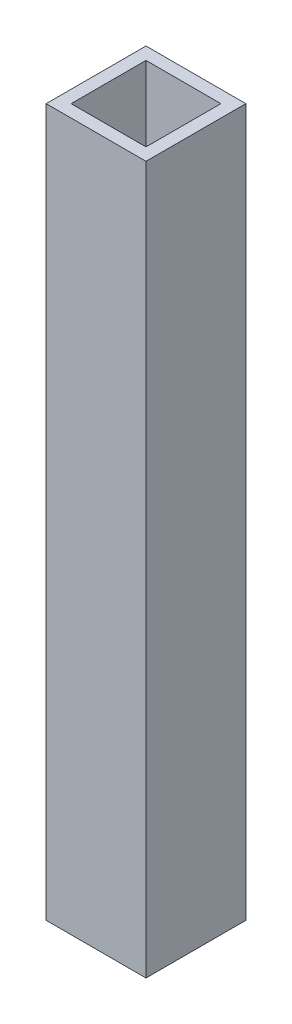
ISO-10303-21;
HEADER;
FILE_DESCRIPTION(('STEP AP214'),'2;1');
FILE_NAME('part.step','',(''),(''),'','','');
FILE_SCHEMA(('AUTOMOTIVE_DESIGN { 1 0 10303 214 1 1 1 1 }'));
ENDSEC;
DATA;
#1=APPLICATION_CONTEXT('core data for automotive mechanical design processes');
#2=APPLICATION_PROTOCOL_DEFINITION('international standard','automotive_design',2000,#1);
#3=PRODUCT_CONTEXT('',#1,'mechanical');
#4=PRODUCT('Part','Part','',(#3));
#5=PRODUCT_RELATED_PRODUCT_CATEGORY('part','',(#4));
#6=PRODUCT_DEFINITION_FORMATION('','',#4);
#7=PRODUCT_DEFINITION_CONTEXT('part definition',#1,'design');
#8=PRODUCT_DEFINITION('design','',#6,#7);
#9=PRODUCT_DEFINITION_SHAPE('','',#8);
#10=(LENGTH_UNIT() NAMED_UNIT(*) SI_UNIT(.MILLI.,.METRE.));
#11=(NAMED_UNIT(*) PLANE_ANGLE_UNIT() SI_UNIT($,.RADIAN.));
#12=(NAMED_UNIT(*) SI_UNIT($,.STERADIAN.) SOLID_ANGLE_UNIT());
#13=UNCERTAINTY_MEASURE_WITH_UNIT(LENGTH_MEASURE(1.E-05),#10,'distance_accuracy_value','');
#14=(GEOMETRIC_REPRESENTATION_CONTEXT(3) GLOBAL_UNCERTAINTY_ASSIGNED_CONTEXT((#13)) GLOBAL_UNIT_ASSIGNED_CONTEXT((#10,
#11,#12)) REPRESENTATION_CONTEXT('',''));
#15=CARTESIAN_POINT('',(0.,0.,0.));
#16=DIRECTION('',(0.,0.,1.));
#17=DIRECTION('',(1.,0.,0.));
#18=AXIS2_PLACEMENT_3D('',#15,#16,#17);
#19=CARTESIAN_POINT('',(0.,170.,0.));
#20=DIRECTION('',(0.,1.,0.));
#21=DIRECTION('',(0.,0.,1.));
#22=AXIS2_PLACEMENT_3D('',#19,#20,#21);
#23=PLANE('',#22);
#24=DIRECTION('',(0.,0.,-1.));
#25=VECTOR('',#24,1.);
#26=CARTESIAN_POINT('',(12.,170.,0.));
#27=LINE('',#26,#25);
#28=CARTESIAN_POINT('',(12.,170.,12.));
#29=VERTEX_POINT('',#28);
#30=CARTESIAN_POINT('',(12.,170.,-12.));
#31=VERTEX_POINT('',#30);
#32=EDGE_CURVE('E164',#29,#31,#27,.T.);
#33=ORIENTED_EDGE('',*,*,#32,.T.);
#34=DIRECTION('',(-1.,0.,0.));
#35=VECTOR('',#34,1.);
#36=CARTESIAN_POINT('',(0.,170.,-12.));
#37=LINE('',#36,#35);
#38=CARTESIAN_POINT('',(-12.,170.,-12.));
#39=VERTEX_POINT('',#38);
#40=EDGE_CURVE('E167',#31,#39,#37,.T.);
#41=ORIENTED_EDGE('',*,*,#40,.T.);
#42=DIRECTION('',(0.,0.,1.));
#43=VECTOR('',#42,1.);
#44=CARTESIAN_POINT('',(-12.,170.,0.));
#45=LINE('',#44,#43);
#46=CARTESIAN_POINT('',(-12.,170.,12.));
#47=VERTEX_POINT('',#46);
#48=EDGE_CURVE('E170',#39,#47,#45,.T.);
#49=ORIENTED_EDGE('',*,*,#48,.T.);
#50=DIRECTION('',(1.,0.,0.));
#51=VECTOR('',#50,1.);
#52=CARTESIAN_POINT('',(0.,170.,12.));
#53=LINE('',#52,#51);
#54=EDGE_CURVE('E172',#47,#29,#53,.T.);
#55=ORIENTED_EDGE('',*,*,#54,.T.);
#56=EDGE_LOOP('',(#33,#41,#49,#55));
#57=FACE_BOUND('',#56,.T.);
#58=DIRECTION('',(-1.,0.,0.));
#59=VECTOR('',#58,1.);
#60=CARTESIAN_POINT('',(-9.,170.,-9.));
#61=LINE('',#60,#59);
#62=CARTESIAN_POINT('',(9.,170.,-9.));
#63=VERTEX_POINT('',#62);
#64=CARTESIAN_POINT('',(-9.,170.,-9.));
#65=VERTEX_POINT('',#64);
#66=EDGE_CURVE('E136',#63,#65,#61,.T.);
#67=ORIENTED_EDGE('',*,*,#66,.F.);
#68=DIRECTION('',(0.,0.,-1.));
#69=VECTOR('',#68,1.);
#70=CARTESIAN_POINT('',(9.,170.,9.));
#71=LINE('',#70,#69);
#72=CARTESIAN_POINT('',(9.,170.,9.));
#73=VERTEX_POINT('',#72);
#74=EDGE_CURVE('E128',#73,#63,#71,.T.);
#75=ORIENTED_EDGE('',*,*,#74,.F.);
#76=DIRECTION('',(1.,0.,0.));
#77=VECTOR('',#76,1.);
#78=CARTESIAN_POINT('',(-9.,170.,9.));
#79=LINE('',#78,#77);
#80=CARTESIAN_POINT('',(-9.,170.,9.));
#81=VERTEX_POINT('',#80);
#82=EDGE_CURVE('E150',#81,#73,#79,.T.);
#83=ORIENTED_EDGE('',*,*,#82,.F.);
#84=DIRECTION('',(0.,0.,1.));
#85=VECTOR('',#84,1.);
#86=CARTESIAN_POINT('',(-9.,170.,9.));
#87=LINE('',#86,#85);
#88=EDGE_CURVE('E148',#65,#81,#87,.T.);
#89=ORIENTED_EDGE('',*,*,#88,.F.);
#90=EDGE_LOOP('',(#67,#75,#83,#89));
#91=FACE_BOUND('',#90,.T.);
#92=ADVANCED_FACE('F63',(#57,#91),#23,.T.);
#93=CARTESIAN_POINT('',(0.,0.,0.));
#94=DIRECTION('',(0.,1.,0.));
#95=DIRECTION('',(0.,0.,1.));
#96=AXIS2_PLACEMENT_3D('',#93,#94,#95);
#97=PLANE('',#96);
#98=DIRECTION('',(0.,0.,-1.));
#99=VECTOR('',#98,1.);
#100=CARTESIAN_POINT('',(12.,0.,0.));
#101=LINE('',#100,#99);
#102=CARTESIAN_POINT('',(12.,0.,12.));
#103=VERTEX_POINT('',#102);
#104=CARTESIAN_POINT('',(12.,0.,-12.));
#105=VERTEX_POINT('',#104);
#106=EDGE_CURVE('E144',#103,#105,#101,.T.);
#107=ORIENTED_EDGE('',*,*,#106,.F.);
#108=DIRECTION('',(1.,0.,0.));
#109=VECTOR('',#108,1.);
#110=CARTESIAN_POINT('',(0.,0.,12.));
#111=LINE('',#110,#109);
#112=CARTESIAN_POINT('',(-12.,0.,12.));
#113=VERTEX_POINT('',#112);
#114=EDGE_CURVE('E168',#113,#103,#111,.T.);
#115=ORIENTED_EDGE('',*,*,#114,.F.);
#116=DIRECTION('',(0.,0.,1.));
#117=VECTOR('',#116,1.);
#118=CARTESIAN_POINT('',(-12.,0.,0.));
#119=LINE('',#118,#117);
#120=CARTESIAN_POINT('',(-12.,0.,-12.));
#121=VERTEX_POINT('',#120);
#122=EDGE_CURVE('E179',#121,#113,#119,.T.);
#123=ORIENTED_EDGE('',*,*,#122,.F.);
#124=DIRECTION('',(-1.,0.,0.));
#125=VECTOR('',#124,1.);
#126=CARTESIAN_POINT('',(0.,0.,-12.));
#127=LINE('',#126,#125);
#128=EDGE_CURVE('E177',#105,#121,#127,.T.);
#129=ORIENTED_EDGE('',*,*,#128,.F.);
#130=EDGE_LOOP('',(#107,#115,#123,#129));
#131=FACE_BOUND('',#130,.T.);
#132=DIRECTION('',(0.,0.,-1.));
#133=VECTOR('',#132,1.);
#134=CARTESIAN_POINT('',(9.,0.,9.));
#135=LINE('',#134,#133);
#136=CARTESIAN_POINT('',(9.,0.,9.));
#137=VERTEX_POINT('',#136);
#138=CARTESIAN_POINT('',(9.,0.,-9.));
#139=VERTEX_POINT('',#138);
#140=EDGE_CURVE('E86',#137,#139,#135,.T.);
#141=ORIENTED_EDGE('',*,*,#140,.T.);
#142=DIRECTION('',(-1.,0.,0.));
#143=VECTOR('',#142,1.);
#144=CARTESIAN_POINT('',(-9.,0.,-9.));
#145=LINE('',#144,#143);
#146=CARTESIAN_POINT('',(-9.,0.,-9.));
#147=VERTEX_POINT('',#146);
#148=EDGE_CURVE('E143',#139,#147,#145,.T.);
#149=ORIENTED_EDGE('',*,*,#148,.T.);
#150=DIRECTION('',(0.,0.,1.));
#151=VECTOR('',#150,1.);
#152=CARTESIAN_POINT('',(-9.,0.,9.));
#153=LINE('',#152,#151);
#154=CARTESIAN_POINT('',(-9.,0.,9.));
#155=VERTEX_POINT('',#154);
#156=EDGE_CURVE('E156',#147,#155,#153,.T.);
#157=ORIENTED_EDGE('',*,*,#156,.T.);
#158=DIRECTION('',(1.,0.,0.));
#159=VECTOR('',#158,1.);
#160=CARTESIAN_POINT('',(-9.,0.,9.));
#161=LINE('',#160,#159);
#162=EDGE_CURVE('E137',#155,#137,#161,.T.);
#163=ORIENTED_EDGE('',*,*,#162,.T.);
#164=EDGE_LOOP('',(#141,#149,#157,#163));
#165=FACE_BOUND('',#164,.T.);
#166=ADVANCED_FACE('F197',(#131,#165),#97,.F.);
#167=CARTESIAN_POINT('',(12.,170.,0.));
#168=DIRECTION('',(-1.,0.,0.));
#169=DIRECTION('',(0.,0.,1.));
#170=AXIS2_PLACEMENT_3D('',#167,#168,#169);
#171=PLANE('',#170);
#172=ORIENTED_EDGE('',*,*,#106,.T.);
#173=DIRECTION('',(0.,-1.,0.));
#174=VECTOR('',#173,1.);
#175=CARTESIAN_POINT('',(12.,170.,-12.));
#176=LINE('',#175,#174);
#177=EDGE_CURVE('E12',#31,#105,#176,.T.);
#178=ORIENTED_EDGE('',*,*,#177,.F.);
#179=ORIENTED_EDGE('',*,*,#32,.F.);
#180=DIRECTION('',(0.,-1.,0.));
#181=VECTOR('',#180,1.);
#182=CARTESIAN_POINT('',(12.,170.,12.));
#183=LINE('',#182,#181);
#184=EDGE_CURVE('E174',#29,#103,#183,.T.);
#185=ORIENTED_EDGE('',*,*,#184,.T.);
#186=EDGE_LOOP('',(#172,#178,#179,#185));
#187=FACE_BOUND('',#186,.T.);
#188=ADVANCED_FACE('F65',(#187),#171,.F.);
#189=CARTESIAN_POINT('',(0.,170.,-12.));
#190=DIRECTION('',(0.,0.,1.));
#191=DIRECTION('',(1.,0.,0.));
#192=AXIS2_PLACEMENT_3D('',#189,#190,#191);
#193=PLANE('',#192);
#194=ORIENTED_EDGE('',*,*,#128,.T.);
#195=DIRECTION('',(0.,-1.,0.));
#196=VECTOR('',#195,1.);
#197=CARTESIAN_POINT('',(-12.,170.,-12.));
#198=LINE('',#197,#196);
#199=EDGE_CURVE('E71',#39,#121,#198,.T.);
#200=ORIENTED_EDGE('',*,*,#199,.F.);
#201=ORIENTED_EDGE('',*,*,#40,.F.);
#202=ORIENTED_EDGE('',*,*,#177,.T.);
#203=EDGE_LOOP('',(#194,#200,#201,#202));
#204=FACE_BOUND('',#203,.T.);
#205=ADVANCED_FACE('F207',(#204),#193,.F.);
#206=CARTESIAN_POINT('',(-12.,170.,0.));
#207=DIRECTION('',(1.,0.,0.));
#208=DIRECTION('',(0.,0.,-1.));
#209=AXIS2_PLACEMENT_3D('',#206,#207,#208);
#210=PLANE('',#209);
#211=ORIENTED_EDGE('',*,*,#122,.T.);
#212=DIRECTION('',(0.,-1.,0.));
#213=VECTOR('',#212,1.);
#214=CARTESIAN_POINT('',(-12.,170.,12.));
#215=LINE('',#214,#213);
#216=EDGE_CURVE('E184',#47,#113,#215,.T.);
#217=ORIENTED_EDGE('',*,*,#216,.F.);
#218=ORIENTED_EDGE('',*,*,#48,.F.);
#219=ORIENTED_EDGE('',*,*,#199,.T.);
#220=EDGE_LOOP('',(#211,#217,#218,#219));
#221=FACE_BOUND('',#220,.T.);
#222=ADVANCED_FACE('F191',(#221),#210,.F.);
#223=CARTESIAN_POINT('',(0.,170.,12.));
#224=DIRECTION('',(0.,0.,-1.));
#225=DIRECTION('',(-1.,0.,0.));
#226=AXIS2_PLACEMENT_3D('',#223,#224,#225);
#227=PLANE('',#226);
#228=ORIENTED_EDGE('',*,*,#114,.T.);
#229=ORIENTED_EDGE('',*,*,#184,.F.);
#230=ORIENTED_EDGE('',*,*,#54,.F.);
#231=ORIENTED_EDGE('',*,*,#216,.T.);
#232=EDGE_LOOP('',(#228,#229,#230,#231));
#233=FACE_BOUND('',#232,.T.);
#234=ADVANCED_FACE('F201',(#233),#227,.F.);
#235=CARTESIAN_POINT('',(9.,170.,9.));
#236=DIRECTION('',(-1.,0.,0.));
#237=DIRECTION('',(0.,0.,1.));
#238=AXIS2_PLACEMENT_3D('',#235,#236,#237);
#239=PLANE('',#238);
#240=ORIENTED_EDGE('',*,*,#140,.F.);
#241=DIRECTION('',(0.,-1.,0.));
#242=VECTOR('',#241,1.);
#243=CARTESIAN_POINT('',(9.,170.,9.));
#244=LINE('',#243,#242);
#245=EDGE_CURVE('E132',#73,#137,#244,.T.);
#246=ORIENTED_EDGE('',*,*,#245,.F.);
#247=ORIENTED_EDGE('',*,*,#74,.T.);
#248=DIRECTION('',(0.,-1.,0.));
#249=VECTOR('',#248,1.);
#250=CARTESIAN_POINT('',(9.,170.,-9.));
#251=LINE('',#250,#249);
#252=EDGE_CURVE('E131',#63,#139,#251,.T.);
#253=ORIENTED_EDGE('',*,*,#252,.T.);
#254=EDGE_LOOP('',(#240,#246,#247,#253));
#255=FACE_BOUND('',#254,.T.);
#256=ADVANCED_FACE('F130',(#255),#239,.T.);
#257=CARTESIAN_POINT('',(-9.,170.,-9.));
#258=DIRECTION('',(0.,0.,1.));
#259=DIRECTION('',(1.,0.,0.));
#260=AXIS2_PLACEMENT_3D('',#257,#258,#259);
#261=PLANE('',#260);
#262=ORIENTED_EDGE('',*,*,#148,.F.);
#263=ORIENTED_EDGE('',*,*,#252,.F.);
#264=ORIENTED_EDGE('',*,*,#66,.T.);
#265=DIRECTION('',(0.,-1.,0.));
#266=VECTOR('',#265,1.);
#267=CARTESIAN_POINT('',(-9.,170.,-9.));
#268=LINE('',#267,#266);
#269=EDGE_CURVE('E145',#65,#147,#268,.T.);
#270=ORIENTED_EDGE('',*,*,#269,.T.);
#271=EDGE_LOOP('',(#262,#263,#264,#270));
#272=FACE_BOUND('',#271,.T.);
#273=ADVANCED_FACE('F140',(#272),#261,.T.);
#274=CARTESIAN_POINT('',(-9.,170.,9.));
#275=DIRECTION('',(1.,0.,0.));
#276=DIRECTION('',(0.,0.,-1.));
#277=AXIS2_PLACEMENT_3D('',#274,#275,#276);
#278=PLANE('',#277);
#279=ORIENTED_EDGE('',*,*,#156,.F.);
#280=ORIENTED_EDGE('',*,*,#269,.F.);
#281=ORIENTED_EDGE('',*,*,#88,.T.);
#282=DIRECTION('',(0.,-1.,0.));
#283=VECTOR('',#282,1.);
#284=CARTESIAN_POINT('',(-9.,170.,9.));
#285=LINE('',#284,#283);
#286=EDGE_CURVE('E78',#81,#155,#285,.T.);
#287=ORIENTED_EDGE('',*,*,#286,.T.);
#288=EDGE_LOOP('',(#279,#280,#281,#287));
#289=FACE_BOUND('',#288,.T.);
#290=ADVANCED_FACE('F230',(#289),#278,.T.);
#291=CARTESIAN_POINT('',(-9.,170.,9.));
#292=DIRECTION('',(0.,0.,-1.));
#293=DIRECTION('',(-1.,0.,0.));
#294=AXIS2_PLACEMENT_3D('',#291,#292,#293);
#295=PLANE('',#294);
#296=ORIENTED_EDGE('',*,*,#162,.F.);
#297=ORIENTED_EDGE('',*,*,#286,.F.);
#298=ORIENTED_EDGE('',*,*,#82,.T.);
#299=ORIENTED_EDGE('',*,*,#245,.T.);
#300=EDGE_LOOP('',(#296,#297,#298,#299));
#301=FACE_BOUND('',#300,.T.);
#302=ADVANCED_FACE('F234',(#301),#295,.T.);
#303=CLOSED_SHELL('',(#92,#166,#188,#205,#222,#234,#256,#273,#290,#302));
#304=MANIFOLD_SOLID_BREP('B2',#303);
#305=ADVANCED_BREP_SHAPE_REPRESENTATION('',(#18,#304),#14);
#306=SHAPE_DEFINITION_REPRESENTATION(#9,#305);
ENDSEC;
END-ISO-10303-21;
